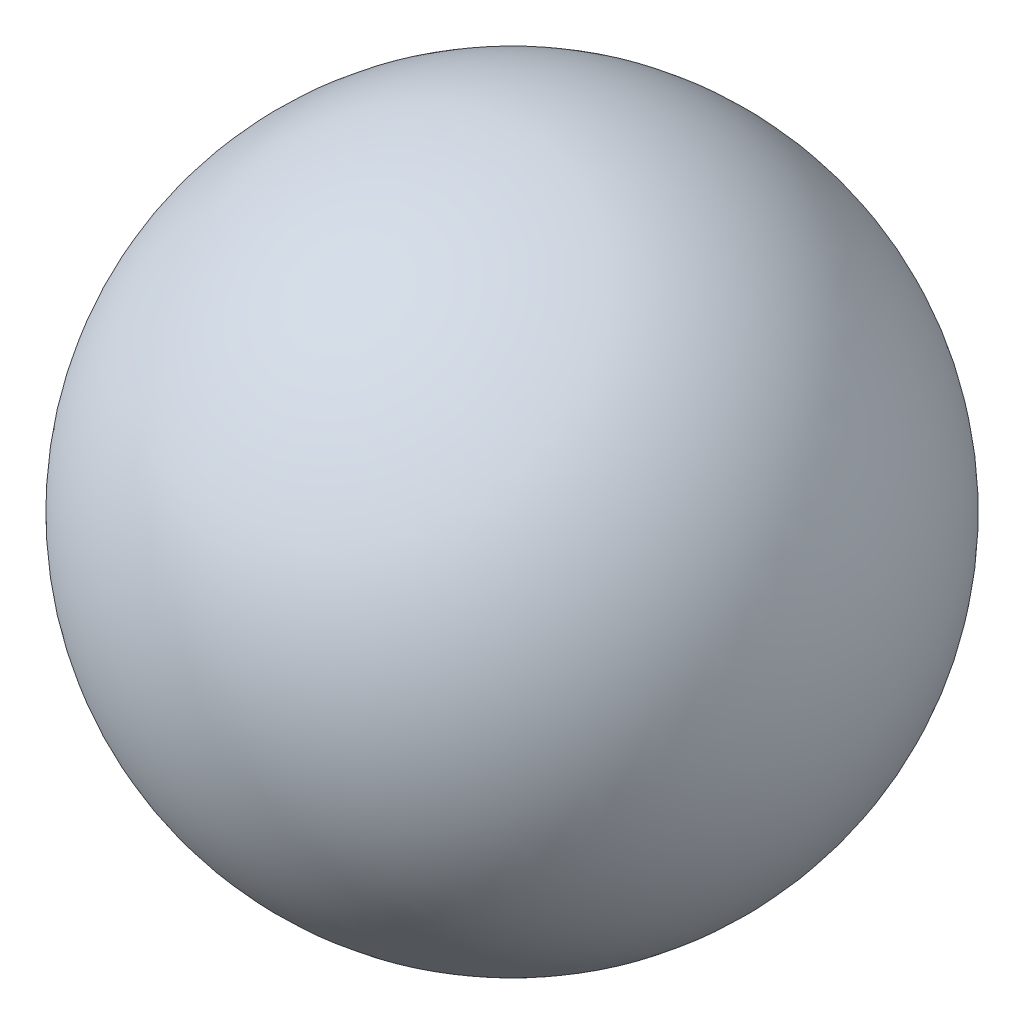
ISO-10303-21;
HEADER;
FILE_DESCRIPTION(('STEP AP214'),'2;1');
FILE_NAME('part.step','',(''),(''),'','','');
FILE_SCHEMA(('AUTOMOTIVE_DESIGN { 1 0 10303 214 1 1 1 1 }'));
ENDSEC;
DATA;
#1=APPLICATION_CONTEXT('core data for automotive mechanical design processes');
#2=APPLICATION_PROTOCOL_DEFINITION('international standard','automotive_design',2000,#1);
#3=PRODUCT_CONTEXT('',#1,'mechanical');
#4=PRODUCT('Part','Part','',(#3));
#5=PRODUCT_RELATED_PRODUCT_CATEGORY('part','',(#4));
#6=PRODUCT_DEFINITION_FORMATION('','',#4);
#7=PRODUCT_DEFINITION_CONTEXT('part definition',#1,'design');
#8=PRODUCT_DEFINITION('design','',#6,#7);
#9=PRODUCT_DEFINITION_SHAPE('','',#8);
#10=(LENGTH_UNIT() NAMED_UNIT(*) SI_UNIT(.MILLI.,.METRE.));
#11=(NAMED_UNIT(*) PLANE_ANGLE_UNIT() SI_UNIT($,.RADIAN.));
#12=(NAMED_UNIT(*) SI_UNIT($,.STERADIAN.) SOLID_ANGLE_UNIT());
#13=UNCERTAINTY_MEASURE_WITH_UNIT(LENGTH_MEASURE(1.E-05),#10,'distance_accuracy_value','');
#14=(GEOMETRIC_REPRESENTATION_CONTEXT(3) GLOBAL_UNCERTAINTY_ASSIGNED_CONTEXT((#13)) GLOBAL_UNIT_ASSIGNED_CONTEXT((#10,
#11,#12)) REPRESENTATION_CONTEXT('',''));
#15=CARTESIAN_POINT('',(0.,0.,0.));
#16=DIRECTION('',(0.,0.,1.));
#17=DIRECTION('',(1.,0.,0.));
#18=AXIS2_PLACEMENT_3D('',#15,#16,#17);
#19=CARTESIAN_POINT('',(0.,0.,0.));
#20=DIRECTION('',(0.,1.,0.));
#21=DIRECTION('',(1.,0.,0.));
#22=AXIS2_PLACEMENT_3D('',#19,#20,#21);
#23=SPHERICAL_SURFACE('',#22,21.5);
#24=CARTESIAN_POINT('',(0.,21.5,0.));
#25=VERTEX_POINT('',#24);
#26=VERTEX_LOOP('',#25);
#27=FACE_BOUND('',#26,.T.);
#28=ADVANCED_FACE('F35',(#27),#23,.T.);
#29=CLOSED_SHELL('',(#28));
#30=MANIFOLD_SOLID_BREP('B2',#29);
#31=ADVANCED_BREP_SHAPE_REPRESENTATION('',(#18,#30),#14);
#32=SHAPE_DEFINITION_REPRESENTATION(#9,#31);
ENDSEC;
END-ISO-10303-21;
